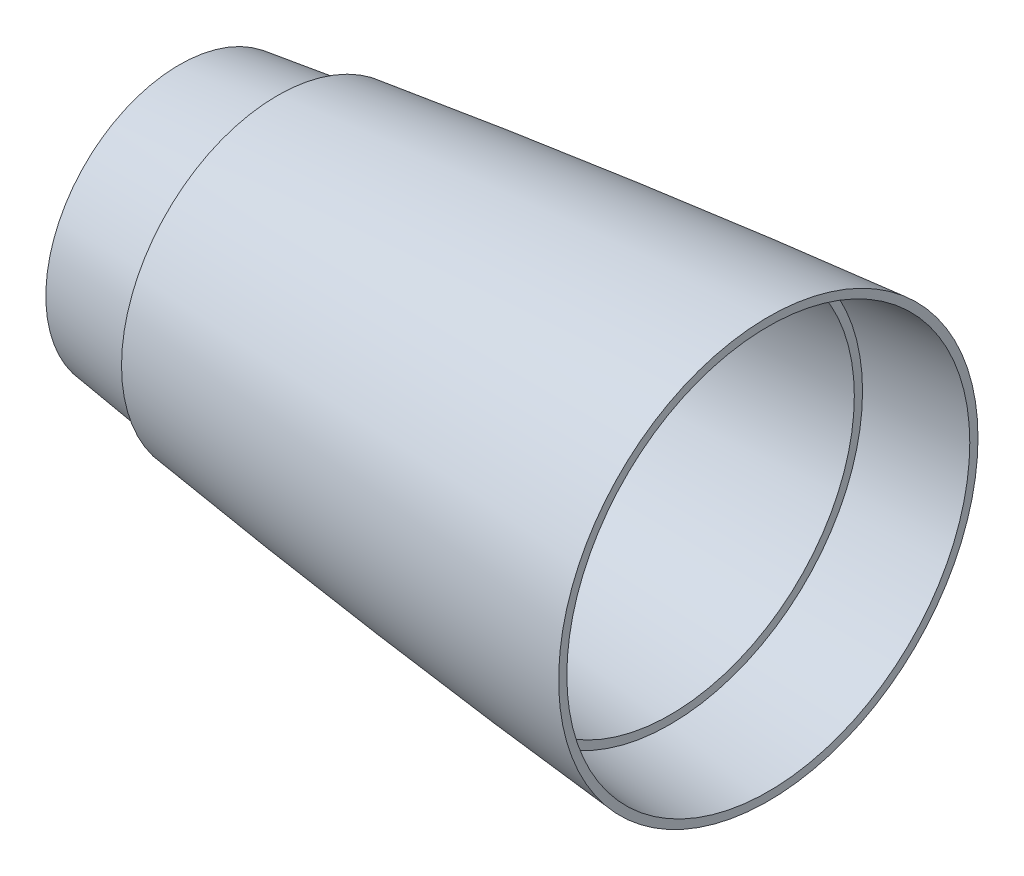
ISO-10303-21;
HEADER;
FILE_DESCRIPTION(('STEP AP214'),'2;1');
FILE_NAME('part.step','',(''),(''),'','','');
FILE_SCHEMA(('AUTOMOTIVE_DESIGN { 1 0 10303 214 1 1 1 1 }'));
ENDSEC;
DATA;
#1=APPLICATION_CONTEXT('core data for automotive mechanical design processes');
#2=APPLICATION_PROTOCOL_DEFINITION('international standard','automotive_design',2000,#1);
#3=PRODUCT_CONTEXT('',#1,'mechanical');
#4=PRODUCT('Part','Part','',(#3));
#5=PRODUCT_RELATED_PRODUCT_CATEGORY('part','',(#4));
#6=PRODUCT_DEFINITION_FORMATION('','',#4);
#7=PRODUCT_DEFINITION_CONTEXT('part definition',#1,'design');
#8=PRODUCT_DEFINITION('design','',#6,#7);
#9=PRODUCT_DEFINITION_SHAPE('','',#8);
#10=(LENGTH_UNIT() NAMED_UNIT(*) SI_UNIT(.MILLI.,.METRE.));
#11=(NAMED_UNIT(*) PLANE_ANGLE_UNIT() SI_UNIT($,.RADIAN.));
#12=(NAMED_UNIT(*) SI_UNIT($,.STERADIAN.) SOLID_ANGLE_UNIT());
#13=UNCERTAINTY_MEASURE_WITH_UNIT(LENGTH_MEASURE(1.E-05),#10,'distance_accuracy_value','');
#14=(GEOMETRIC_REPRESENTATION_CONTEXT(3) GLOBAL_UNCERTAINTY_ASSIGNED_CONTEXT((#13)) GLOBAL_UNIT_ASSIGNED_CONTEXT((#10,
#11,#12)) REPRESENTATION_CONTEXT('',''));
#15=CARTESIAN_POINT('',(0.,0.,0.));
#16=DIRECTION('',(0.,0.,1.));
#17=DIRECTION('',(1.,0.,0.));
#18=AXIS2_PLACEMENT_3D('',#15,#16,#17);
#19=CARTESIAN_POINT('',(0.,3557.29676158737,0.));
#20=DIRECTION('',(1.,0.,0.));
#21=DIRECTION('',(0.,0.,-1.));
#22=AXIS2_PLACEMENT_3D('',#19,#20,#21);
#23=DEGENERATE_TOROIDAL_SURFACE('',#22,3557.29676158737,3632.7,.F.);
#24=CARTESIAN_POINT('',(-469.999999999507,3557.29676158737,0.));
#25=DIRECTION('',(1.,0.,0.));
#26=DIRECTION('',(0.,0.,-1.));
#27=AXIS2_PLACEMENT_3D('',#24,#25,#26);
#28=CIRCLE('',#27,44.8705429669931);
#29=CARTESIAN_POINT('',(-469.999999999507,3557.29676158737,-44.8705429669931));
#30=VERTEX_POINT('',#29);
#31=EDGE_CURVE('E62',#30,#30,#28,.T.);
#32=ORIENTED_EDGE('',*,*,#31,.F.);
#33=EDGE_LOOP('',(#32));
#34=FACE_BOUND('',#33,.T.);
#35=CARTESIAN_POINT('',(-499.999999999484,3557.29676158737,0.));
#36=DIRECTION('',(1.,0.,0.));
#37=DIRECTION('',(0.,0.,-1.));
#38=AXIS2_PLACEMENT_3D('',#35,#36,#37);
#39=CIRCLE('',#38,40.8290408270617);
#40=CARTESIAN_POINT('',(-499.999999999484,3557.29676158737,-40.8290408270617));
#41=VERTEX_POINT('',#40);
#42=EDGE_CURVE('E10',#41,#41,#39,.T.);
#43=ORIENTED_EDGE('',*,*,#42,.T.);
#44=EDGE_LOOP('',(#43));
#45=FACE_BOUND('',#44,.T.);
#46=ADVANCED_FACE('F34',(#34,#45),#23,.F.);
#47=CARTESIAN_POINT('',(-499.999999999484,0.,0.));
#48=DIRECTION('',(-1.,0.,0.));
#49=DIRECTION('',(0.,0.,1.));
#50=AXIS2_PLACEMENT_3D('',#47,#48,#49);
#51=PLANE('',#50);
#52=CARTESIAN_POINT('',(-499.999999999484,3557.29676158737,0.));
#53=DIRECTION('',(1.,0.,0.));
#54=DIRECTION('',(0.,0.,-1.));
#55=AXIS2_PLACEMENT_3D('',#52,#53,#54);
#56=CIRCLE('',#55,38.6078881496754);
#57=CARTESIAN_POINT('',(-499.999999999484,3557.29676158737,-38.6078881496754));
#58=VERTEX_POINT('',#57);
#59=EDGE_CURVE('E40',#58,#58,#56,.T.);
#60=ORIENTED_EDGE('',*,*,#59,.T.);
#61=EDGE_LOOP('',(#60));
#62=FACE_BOUND('',#61,.T.);
#63=ORIENTED_EDGE('',*,*,#42,.F.);
#64=EDGE_LOOP('',(#63));
#65=FACE_BOUND('',#64,.T.);
#66=ADVANCED_FACE('F70',(#62,#65),#51,.T.);
#67=CARTESIAN_POINT('',(0.,3557.29676158737,0.));
#68=DIRECTION('',(1.,0.,0.));
#69=DIRECTION('',(0.,0.,-1.));
#70=AXIS2_PLACEMENT_3D('',#67,#68,#69);
#71=DEGENERATE_TOROIDAL_SURFACE('',#70,3557.29676158737,3630.5,.F.);
#72=ORIENTED_EDGE('',*,*,#59,.F.);
#73=EDGE_LOOP('',(#72));
#74=FACE_BOUND('',#73,.T.);
#75=CARTESIAN_POINT('',(-349.99999999953,3557.29676158737,0.));
#76=DIRECTION('',(1.,0.,0.));
#77=DIRECTION('',(0.,0.,-1.));
#78=AXIS2_PLACEMENT_3D('',#75,#76,#77);
#79=CIRCLE('',#78,56.2929010611599);
#80=CARTESIAN_POINT('',(-349.99999999953,3557.29676158737,-56.2929010611599));
#81=VERTEX_POINT('',#80);
#82=EDGE_CURVE('E44',#81,#81,#79,.T.);
#83=ORIENTED_EDGE('',*,*,#82,.T.);
#84=EDGE_LOOP('',(#83));
#85=FACE_BOUND('',#84,.T.);
#86=ADVANCED_FACE('F74',(#74,#85),#71,.T.);
#87=CARTESIAN_POINT('',(-349.99999999953,0.,0.));
#88=DIRECTION('',(-1.,0.,0.));
#89=DIRECTION('',(0.,0.,1.));
#90=AXIS2_PLACEMENT_3D('',#87,#88,#89);
#91=PLANE('',#90);
#92=ORIENTED_EDGE('',*,*,#82,.F.);
#93=EDGE_LOOP('',(#92));
#94=FACE_BOUND('',#93,.T.);
#95=CARTESIAN_POINT('',(-349.99999999953,3557.29676158737,0.));
#96=DIRECTION('',(1.,0.,0.));
#97=DIRECTION('',(0.,0.,-1.));
#98=AXIS2_PLACEMENT_3D('',#95,#96,#97);
#99=CIRCLE('',#98,58.8045920807367);
#100=CARTESIAN_POINT('',(-349.99999999953,3557.29676158737,-58.8045920807367));
#101=VERTEX_POINT('',#100);
#102=EDGE_CURVE('E48',#101,#101,#99,.T.);
#103=ORIENTED_EDGE('',*,*,#102,.T.);
#104=EDGE_LOOP('',(#103));
#105=FACE_BOUND('',#104,.T.);
#106=ADVANCED_FACE('F78',(#94,#105),#91,.F.);
#107=CARTESIAN_POINT('',(0.,3557.29676158737,0.));
#108=DIRECTION('',(1.,0.,0.));
#109=DIRECTION('',(0.,0.,-1.));
#110=AXIS2_PLACEMENT_3D('',#107,#108,#109);
#111=DEGENERATE_TOROIDAL_SURFACE('',#110,3557.29676158737,3633.,.F.);
#112=CARTESIAN_POINT('',(-319.999999999553,3557.29676158737,0.));
#113=DIRECTION('',(1.,0.,0.));
#114=DIRECTION('',(0.,0.,-1.));
#115=AXIS2_PLACEMENT_3D('',#112,#113,#114);
#116=CIRCLE('',#115,61.582761137899);
#117=CARTESIAN_POINT('',(-319.999999999553,3557.29676158737,-61.582761137899));
#118=VERTEX_POINT('',#117);
#119=EDGE_CURVE('E53',#118,#118,#116,.T.);
#120=ORIENTED_EDGE('',*,*,#119,.T.);
#121=EDGE_LOOP('',(#120));
#122=FACE_BOUND('',#121,.T.);
#123=ORIENTED_EDGE('',*,*,#102,.F.);
#124=EDGE_LOOP('',(#123));
#125=FACE_BOUND('',#124,.T.);
#126=ADVANCED_FACE('F85',(#122,#125),#111,.T.);
#127=CARTESIAN_POINT('',(-319.999999999553,0.,0.));
#128=DIRECTION('',(-1.,0.,0.));
#129=DIRECTION('',(0.,0.,1.));
#130=AXIS2_PLACEMENT_3D('',#127,#128,#129);
#131=PLANE('',#130);
#132=ORIENTED_EDGE('',*,*,#119,.F.);
#133=EDGE_LOOP('',(#132));
#134=FACE_BOUND('',#133,.T.);
#135=CARTESIAN_POINT('',(-319.999999999553,3557.29676158737,0.));
#136=DIRECTION('',(1.,0.,0.));
#137=DIRECTION('',(0.,0.,-1.));
#138=AXIS2_PLACEMENT_3D('',#135,#136,#137);
#139=CIRCLE('',#138,64.0925091208029);
#140=CARTESIAN_POINT('',(-319.999999999553,3557.29676158737,-64.0925091208029));
#141=VERTEX_POINT('',#140);
#142=EDGE_CURVE('E56',#141,#141,#139,.T.);
#143=ORIENTED_EDGE('',*,*,#142,.T.);
#144=EDGE_LOOP('',(#143));
#145=FACE_BOUND('',#144,.T.);
#146=ADVANCED_FACE('F89',(#134,#145),#131,.F.);
#147=CARTESIAN_POINT('',(0.,3557.29676158737,0.));
#148=DIRECTION('',(1.,0.,0.));
#149=DIRECTION('',(0.,0.,-1.));
#150=AXIS2_PLACEMENT_3D('',#147,#148,#149);
#151=DEGENERATE_TOROIDAL_SURFACE('',#150,3557.29676158737,3635.5,.F.);
#152=CARTESIAN_POINT('',(-469.999999999507,3557.29676158737,0.));
#153=DIRECTION('',(1.,0.,0.));
#154=DIRECTION('',(0.,0.,-1.));
#155=AXIS2_PLACEMENT_3D('',#152,#153,#154);
#156=CIRCLE('',#155,47.6942578189821);
#157=CARTESIAN_POINT('',(-469.999999999507,3557.29676158737,-47.6942578189821));
#158=VERTEX_POINT('',#157);
#159=EDGE_CURVE('E59',#158,#158,#156,.T.);
#160=ORIENTED_EDGE('',*,*,#159,.T.);
#161=EDGE_LOOP('',(#160));
#162=FACE_BOUND('',#161,.T.);
#163=ORIENTED_EDGE('',*,*,#142,.F.);
#164=EDGE_LOOP('',(#163));
#165=FACE_BOUND('',#164,.T.);
#166=ADVANCED_FACE('F93',(#162,#165),#151,.F.);
#167=CARTESIAN_POINT('',(-469.999999999507,0.,0.));
#168=DIRECTION('',(-1.,0.,0.));
#169=DIRECTION('',(0.,0.,1.));
#170=AXIS2_PLACEMENT_3D('',#167,#168,#169);
#171=PLANE('',#170);
#172=ORIENTED_EDGE('',*,*,#31,.T.);
#173=EDGE_LOOP('',(#172));
#174=FACE_BOUND('',#173,.T.);
#175=ORIENTED_EDGE('',*,*,#159,.F.);
#176=EDGE_LOOP('',(#175));
#177=FACE_BOUND('',#176,.T.);
#178=ADVANCED_FACE('F66',(#174,#177),#171,.T.);
#179=CLOSED_SHELL('',(#46,#66,#86,#106,#126,#146,#166,#178));
#180=MANIFOLD_SOLID_BREP('B2',#179);
#181=ADVANCED_BREP_SHAPE_REPRESENTATION('',(#18,#180),#14);
#182=SHAPE_DEFINITION_REPRESENTATION(#9,#181);
ENDSEC;
END-ISO-10303-21;
